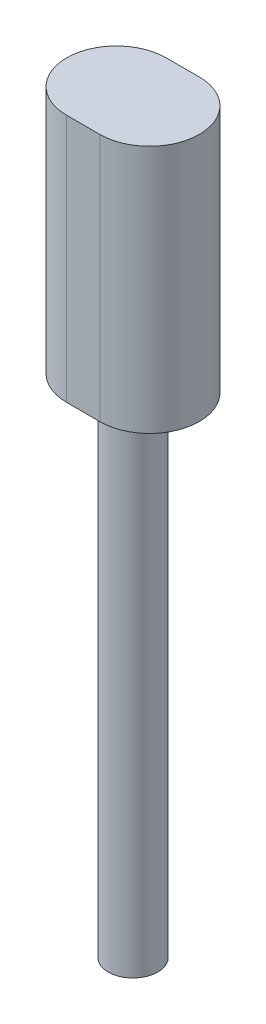
ISO-10303-21;
HEADER;
FILE_DESCRIPTION(('STEP AP214'),'2;1');
FILE_NAME('part.step','',(''),(''),'','','');
FILE_SCHEMA(('AUTOMOTIVE_DESIGN { 1 0 10303 214 1 1 1 1 }'));
ENDSEC;
DATA;
#1=APPLICATION_CONTEXT('core data for automotive mechanical design processes');
#2=APPLICATION_PROTOCOL_DEFINITION('international standard','automotive_design',2000,#1);
#3=PRODUCT_CONTEXT('',#1,'mechanical');
#4=PRODUCT('Part','Part','',(#3));
#5=PRODUCT_RELATED_PRODUCT_CATEGORY('part','',(#4));
#6=PRODUCT_DEFINITION_FORMATION('','',#4);
#7=PRODUCT_DEFINITION_CONTEXT('part definition',#1,'design');
#8=PRODUCT_DEFINITION('design','',#6,#7);
#9=PRODUCT_DEFINITION_SHAPE('','',#8);
#10=(LENGTH_UNIT() NAMED_UNIT(*) SI_UNIT(.MILLI.,.METRE.));
#11=(NAMED_UNIT(*) PLANE_ANGLE_UNIT() SI_UNIT($,.RADIAN.));
#12=(NAMED_UNIT(*) SI_UNIT($,.STERADIAN.) SOLID_ANGLE_UNIT());
#13=UNCERTAINTY_MEASURE_WITH_UNIT(LENGTH_MEASURE(1.E-05),#10,'distance_accuracy_value','');
#14=(GEOMETRIC_REPRESENTATION_CONTEXT(3) GLOBAL_UNCERTAINTY_ASSIGNED_CONTEXT((#13)) GLOBAL_UNIT_ASSIGNED_CONTEXT((#10,
#11,#12)) REPRESENTATION_CONTEXT('',''));
#15=CARTESIAN_POINT('',(0.,0.,0.));
#16=DIRECTION('',(0.,0.,1.));
#17=DIRECTION('',(1.,0.,0.));
#18=AXIS2_PLACEMENT_3D('',#15,#16,#17);
#19=CARTESIAN_POINT('',(-1.,15.,0.));
#20=DIRECTION('',(0.,-1.,0.));
#21=DIRECTION('',(0.,0.,-1.));
#22=AXIS2_PLACEMENT_3D('',#19,#20,#21);
#23=CYLINDRICAL_SURFACE('',#22,3.);
#24=CARTESIAN_POINT('',(-1.,0.,0.));
#25=DIRECTION('',(0.,1.,0.));
#26=DIRECTION('',(0.,0.,1.));
#27=AXIS2_PLACEMENT_3D('',#24,#25,#26);
#28=CIRCLE('',#27,3.);
#29=CARTESIAN_POINT('',(-1.,0.,-3.));
#30=VERTEX_POINT('',#29);
#31=CARTESIAN_POINT('',(-1.,0.,3.));
#32=VERTEX_POINT('',#31);
#33=EDGE_CURVE('E96',#30,#32,#28,.T.);
#34=ORIENTED_EDGE('',*,*,#33,.T.);
#35=DIRECTION('',(0.,-1.,0.));
#36=VECTOR('',#35,1.);
#37=CARTESIAN_POINT('',(-1.,15.,3.));
#38=LINE('',#37,#36);
#39=CARTESIAN_POINT('',(-1.,15.,3.));
#40=VERTEX_POINT('',#39);
#41=EDGE_CURVE('E11',#40,#32,#38,.T.);
#42=ORIENTED_EDGE('',*,*,#41,.F.);
#43=CARTESIAN_POINT('',(-1.,15.,0.));
#44=DIRECTION('',(0.,1.,0.));
#45=DIRECTION('',(0.,0.,1.));
#46=AXIS2_PLACEMENT_3D('',#43,#44,#45);
#47=CIRCLE('',#46,3.);
#48=CARTESIAN_POINT('',(-1.,15.,-3.));
#49=VERTEX_POINT('',#48);
#50=EDGE_CURVE('E84',#49,#40,#47,.T.);
#51=ORIENTED_EDGE('',*,*,#50,.F.);
#52=DIRECTION('',(0.,-1.,0.));
#53=VECTOR('',#52,1.);
#54=CARTESIAN_POINT('',(-1.,15.,-3.));
#55=LINE('',#54,#53);
#56=EDGE_CURVE('E92',#49,#30,#55,.T.);
#57=ORIENTED_EDGE('',*,*,#56,.T.);
#58=EDGE_LOOP('',(#34,#42,#51,#57));
#59=FACE_BOUND('',#58,.T.);
#60=ADVANCED_FACE('F33',(#59),#23,.T.);
#61=CARTESIAN_POINT('',(-1.,15.,3.));
#62=DIRECTION('',(0.,0.,-1.));
#63=DIRECTION('',(-1.,0.,0.));
#64=AXIS2_PLACEMENT_3D('',#61,#62,#63);
#65=PLANE('',#64);
#66=DIRECTION('',(1.,0.,0.));
#67=VECTOR('',#66,1.);
#68=CARTESIAN_POINT('',(-1.,0.,3.));
#69=LINE('',#68,#67);
#70=CARTESIAN_POINT('',(1.,0.,3.));
#71=VERTEX_POINT('',#70);
#72=EDGE_CURVE('E88',#32,#71,#69,.T.);
#73=ORIENTED_EDGE('',*,*,#72,.T.);
#74=DIRECTION('',(0.,-1.,0.));
#75=VECTOR('',#74,1.);
#76=CARTESIAN_POINT('',(1.,15.,3.));
#77=LINE('',#76,#75);
#78=CARTESIAN_POINT('',(1.,15.,3.));
#79=VERTEX_POINT('',#78);
#80=EDGE_CURVE('E41',#79,#71,#77,.T.);
#81=ORIENTED_EDGE('',*,*,#80,.F.);
#82=DIRECTION('',(1.,0.,0.));
#83=VECTOR('',#82,1.);
#84=CARTESIAN_POINT('',(-1.,15.,3.));
#85=LINE('',#84,#83);
#86=EDGE_CURVE('E79',#40,#79,#85,.T.);
#87=ORIENTED_EDGE('',*,*,#86,.F.);
#88=ORIENTED_EDGE('',*,*,#41,.T.);
#89=EDGE_LOOP('',(#73,#81,#87,#88));
#90=FACE_BOUND('',#89,.T.);
#91=ADVANCED_FACE('F87',(#90),#65,.F.);
#92=CARTESIAN_POINT('',(1.,15.,0.));
#93=DIRECTION('',(0.,-1.,0.));
#94=DIRECTION('',(0.,0.,-1.));
#95=AXIS2_PLACEMENT_3D('',#92,#93,#94);
#96=CYLINDRICAL_SURFACE('',#95,3.);
#97=CARTESIAN_POINT('',(1.,0.,0.));
#98=DIRECTION('',(0.,1.,0.));
#99=DIRECTION('',(0.,0.,1.));
#100=AXIS2_PLACEMENT_3D('',#97,#98,#99);
#101=CIRCLE('',#100,3.);
#102=CARTESIAN_POINT('',(0.999999999999999,0.,-3.));
#103=VERTEX_POINT('',#102);
#104=EDGE_CURVE('E66',#71,#103,#101,.T.);
#105=ORIENTED_EDGE('',*,*,#104,.T.);
#106=DIRECTION('',(0.,-1.,0.));
#107=VECTOR('',#106,1.);
#108=CARTESIAN_POINT('',(0.999999999999999,15.,-3.));
#109=LINE('',#108,#107);
#110=CARTESIAN_POINT('',(0.999999999999999,15.,-3.));
#111=VERTEX_POINT('',#110);
#112=EDGE_CURVE('E89',#111,#103,#109,.T.);
#113=ORIENTED_EDGE('',*,*,#112,.F.);
#114=CARTESIAN_POINT('',(1.,15.,0.));
#115=DIRECTION('',(0.,1.,0.));
#116=DIRECTION('',(0.,0.,1.));
#117=AXIS2_PLACEMENT_3D('',#114,#115,#116);
#118=CIRCLE('',#117,3.);
#119=EDGE_CURVE('E82',#79,#111,#118,.T.);
#120=ORIENTED_EDGE('',*,*,#119,.F.);
#121=ORIENTED_EDGE('',*,*,#80,.T.);
#122=EDGE_LOOP('',(#105,#113,#120,#121));
#123=FACE_BOUND('',#122,.T.);
#124=ADVANCED_FACE('F90',(#123),#96,.T.);
#125=CARTESIAN_POINT('',(-1.,15.,-3.));
#126=DIRECTION('',(0.,0.,1.));
#127=DIRECTION('',(1.,0.,0.));
#128=AXIS2_PLACEMENT_3D('',#125,#126,#127);
#129=PLANE('',#128);
#130=DIRECTION('',(-1.,0.,0.));
#131=VECTOR('',#130,1.);
#132=CARTESIAN_POINT('',(-1.,0.,-3.));
#133=LINE('',#132,#131);
#134=EDGE_CURVE('E72',#103,#30,#133,.T.);
#135=ORIENTED_EDGE('',*,*,#134,.T.);
#136=ORIENTED_EDGE('',*,*,#56,.F.);
#137=DIRECTION('',(-1.,0.,0.));
#138=VECTOR('',#137,1.);
#139=CARTESIAN_POINT('',(-1.,15.,-3.));
#140=LINE('',#139,#138);
#141=EDGE_CURVE('E49',#111,#49,#140,.T.);
#142=ORIENTED_EDGE('',*,*,#141,.F.);
#143=ORIENTED_EDGE('',*,*,#112,.T.);
#144=EDGE_LOOP('',(#135,#136,#142,#143));
#145=FACE_BOUND('',#144,.T.);
#146=ADVANCED_FACE('F104',(#145),#129,.F.);
#147=CARTESIAN_POINT('',(-1.,15.,0.));
#148=DIRECTION('',(0.,1.,0.));
#149=DIRECTION('',(0.,0.,1.));
#150=AXIS2_PLACEMENT_3D('',#147,#148,#149);
#151=PLANE('',#150);
#152=ORIENTED_EDGE('',*,*,#50,.T.);
#153=ORIENTED_EDGE('',*,*,#86,.T.);
#154=ORIENTED_EDGE('',*,*,#119,.T.);
#155=ORIENTED_EDGE('',*,*,#141,.T.);
#156=EDGE_LOOP('',(#152,#153,#154,#155));
#157=FACE_BOUND('',#156,.T.);
#158=ADVANCED_FACE('F80',(#157),#151,.T.);
#159=CARTESIAN_POINT('',(-1.,0.,0.));
#160=DIRECTION('',(0.,1.,0.));
#161=DIRECTION('',(0.,0.,1.));
#162=AXIS2_PLACEMENT_3D('',#159,#160,#161);
#163=PLANE('',#162);
#164=CARTESIAN_POINT('',(0.,0.,0.));
#165=DIRECTION('',(0.,1.,0.));
#166=DIRECTION('',(0.,0.,1.));
#167=AXIS2_PLACEMENT_3D('',#164,#165,#166);
#168=CIRCLE('',#167,1.5);
#169=CARTESIAN_POINT('',(0.,0.,1.5));
#170=VERTEX_POINT('',#169);
#171=EDGE_CURVE('E110',#170,#170,#168,.T.);
#172=ORIENTED_EDGE('',*,*,#171,.T.);
#173=EDGE_LOOP('',(#172));
#174=FACE_BOUND('',#173,.T.);
#175=ORIENTED_EDGE('',*,*,#33,.F.);
#176=ORIENTED_EDGE('',*,*,#134,.F.);
#177=ORIENTED_EDGE('',*,*,#104,.F.);
#178=ORIENTED_EDGE('',*,*,#72,.F.);
#179=EDGE_LOOP('',(#175,#176,#177,#178));
#180=FACE_BOUND('',#179,.T.);
#181=ADVANCED_FACE('F107',(#174,#180),#163,.F.);
#182=CARTESIAN_POINT('',(0.,-30.,0.));
#183=DIRECTION('',(0.,1.,0.));
#184=DIRECTION('',(0.,0.,1.));
#185=AXIS2_PLACEMENT_3D('',#182,#183,#184);
#186=CYLINDRICAL_SURFACE('',#185,1.5);
#187=CARTESIAN_POINT('',(0.,-30.,0.));
#188=DIRECTION('',(0.,1.,0.));
#189=DIRECTION('',(0.,0.,1.));
#190=AXIS2_PLACEMENT_3D('',#187,#188,#189);
#191=CIRCLE('',#190,1.5);
#192=CARTESIAN_POINT('',(0.,-30.,1.5));
#193=VERTEX_POINT('',#192);
#194=EDGE_CURVE('E99',#193,#193,#191,.T.);
#195=ORIENTED_EDGE('',*,*,#194,.T.);
#196=EDGE_LOOP('',(#195));
#197=FACE_BOUND('',#196,.T.);
#198=ORIENTED_EDGE('',*,*,#171,.F.);
#199=EDGE_LOOP('',(#198));
#200=FACE_BOUND('',#199,.T.);
#201=ADVANCED_FACE('F116',(#197,#200),#186,.T.);
#202=CARTESIAN_POINT('',(0.,-30.,0.));
#203=DIRECTION('',(0.,1.,0.));
#204=DIRECTION('',(0.,0.,1.));
#205=AXIS2_PLACEMENT_3D('',#202,#203,#204);
#206=PLANE('',#205);
#207=ORIENTED_EDGE('',*,*,#194,.F.);
#208=EDGE_LOOP('',(#207));
#209=FACE_BOUND('',#208,.T.);
#210=ADVANCED_FACE('F119',(#209),#206,.F.);
#211=CLOSED_SHELL('',(#60,#91,#124,#146,#158,#181,#201,#210));
#212=MANIFOLD_SOLID_BREP('B2',#211);
#213=ADVANCED_BREP_SHAPE_REPRESENTATION('',(#18,#212),#14);
#214=SHAPE_DEFINITION_REPRESENTATION(#9,#213);
ENDSEC;
END-ISO-10303-21;
